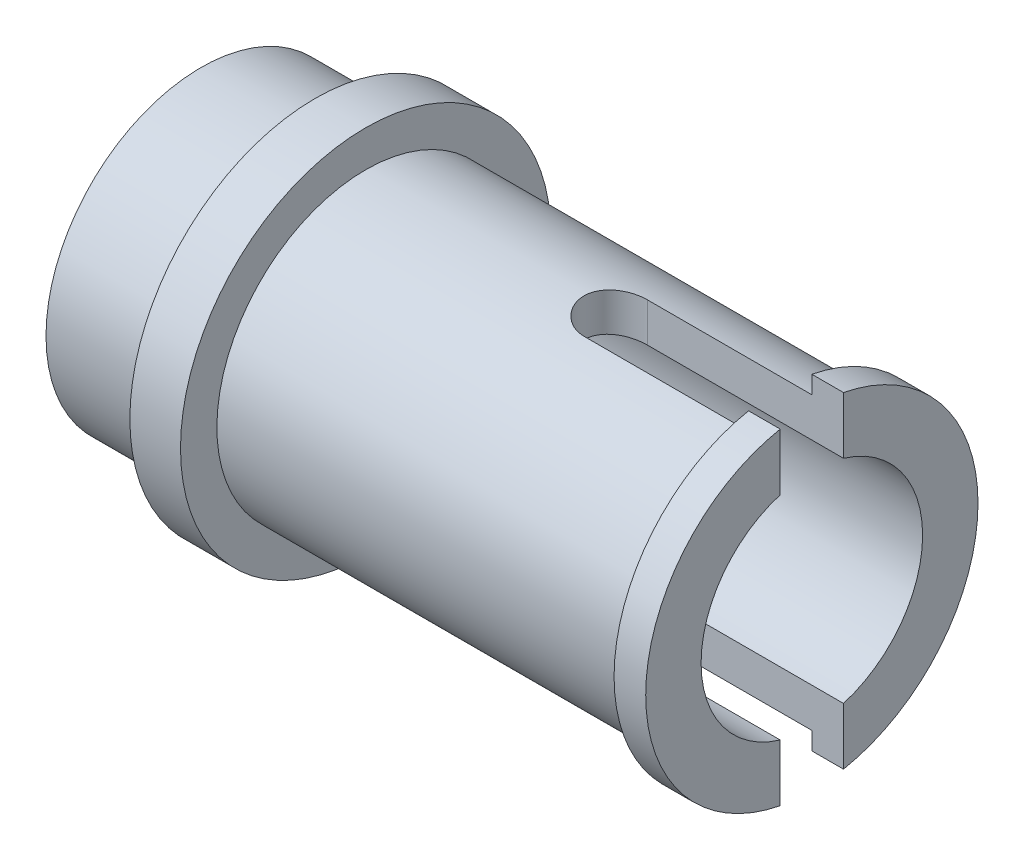
ISO-10303-21;
HEADER;
FILE_DESCRIPTION(('STEP AP214'),'2;1');
FILE_NAME('part.step','',(''),(''),'','','');
FILE_SCHEMA(('AUTOMOTIVE_DESIGN { 1 0 10303 214 1 1 1 1 }'));
ENDSEC;
DATA;
#1=APPLICATION_CONTEXT('core data for automotive mechanical design processes');
#2=APPLICATION_PROTOCOL_DEFINITION('international standard','automotive_design',2000,#1);
#3=PRODUCT_CONTEXT('',#1,'mechanical');
#4=PRODUCT('Part','Part','',(#3));
#5=PRODUCT_RELATED_PRODUCT_CATEGORY('part','',(#4));
#6=PRODUCT_DEFINITION_FORMATION('','',#4);
#7=PRODUCT_DEFINITION_CONTEXT('part definition',#1,'design');
#8=PRODUCT_DEFINITION('design','',#6,#7);
#9=PRODUCT_DEFINITION_SHAPE('','',#8);
#10=(LENGTH_UNIT() NAMED_UNIT(*) SI_UNIT(.MILLI.,.METRE.));
#11=(NAMED_UNIT(*) PLANE_ANGLE_UNIT() SI_UNIT($,.RADIAN.));
#12=(NAMED_UNIT(*) SI_UNIT($,.STERADIAN.) SOLID_ANGLE_UNIT());
#13=UNCERTAINTY_MEASURE_WITH_UNIT(LENGTH_MEASURE(1.E-05),#10,'distance_accuracy_value','');
#14=(GEOMETRIC_REPRESENTATION_CONTEXT(3) GLOBAL_UNCERTAINTY_ASSIGNED_CONTEXT((#13)) GLOBAL_UNIT_ASSIGNED_CONTEXT((#10,
#11,#12)) REPRESENTATION_CONTEXT('',''));
#15=CARTESIAN_POINT('',(0.,0.,0.));
#16=DIRECTION('',(0.,0.,1.));
#17=DIRECTION('',(1.,0.,0.));
#18=AXIS2_PLACEMENT_3D('',#15,#16,#17);
#19=CARTESIAN_POINT('',(7.85,0.,0.));
#20=DIRECTION('',(1.,0.,0.));
#21=DIRECTION('',(0.,0.,-1.));
#22=AXIS2_PLACEMENT_3D('',#19,#20,#21);
#23=PLANE('',#22);
#24=DIRECTION('',(0.,-1.,0.));
#25=VECTOR('',#24,1.);
#26=CARTESIAN_POINT('',(7.85,0.,0.5));
#27=LINE('',#26,#25);
#28=CARTESIAN_POINT('',(7.85,2.57694101601104,0.5));
#29=VERTEX_POINT('',#28);
#30=CARTESIAN_POINT('',(7.85,1.67705098312484,0.5));
#31=VERTEX_POINT('',#30);
#32=EDGE_CURVE('E166',#29,#31,#27,.T.);
#33=ORIENTED_EDGE('',*,*,#32,.F.);
#34=CARTESIAN_POINT('',(7.85,0.,0.));
#35=DIRECTION('',(1.,0.,0.));
#36=DIRECTION('',(0.,0.,-1.));
#37=AXIS2_PLACEMENT_3D('',#34,#35,#36);
#38=CIRCLE('',#37,2.625);
#39=CARTESIAN_POINT('',(7.85,-2.57694101601104,0.5));
#40=VERTEX_POINT('',#39);
#41=EDGE_CURVE('E239',#29,#40,#38,.T.);
#42=ORIENTED_EDGE('',*,*,#41,.T.);
#43=CARTESIAN_POINT('',(7.85,-1.67705098312484,0.5));
#44=VERTEX_POINT('',#43);
#45=EDGE_CURVE('E162',#44,#40,#27,.T.);
#46=ORIENTED_EDGE('',*,*,#45,.F.);
#47=CARTESIAN_POINT('',(7.85,0.,0.));
#48=DIRECTION('',(1.,0.,0.));
#49=DIRECTION('',(0.,0.,-1.));
#50=AXIS2_PLACEMENT_3D('',#47,#48,#49);
#51=CIRCLE('',#50,1.75);
#52=EDGE_CURVE('E241',#31,#44,#51,.T.);
#53=ORIENTED_EDGE('',*,*,#52,.F.);
#54=EDGE_LOOP('',(#33,#42,#46,#53));
#55=FACE_BOUND('',#54,.T.);
#56=ADVANCED_FACE('F33',(#55),#23,.T.);
#57=CARTESIAN_POINT('',(7.35,0.,0.));
#58=DIRECTION('',(1.,0.,0.));
#59=DIRECTION('',(0.,0.,-1.));
#60=AXIS2_PLACEMENT_3D('',#57,#58,#59);
#61=PLANE('',#60);
#62=CARTESIAN_POINT('',(7.35,0.,0.));
#63=DIRECTION('',(1.,0.,0.));
#64=DIRECTION('',(0.,0.,-1.));
#65=AXIS2_PLACEMENT_3D('',#62,#63,#64);
#66=CIRCLE('',#65,2.625);
#67=CARTESIAN_POINT('',(7.35,2.57694101601104,0.5));
#68=VERTEX_POINT('',#67);
#69=CARTESIAN_POINT('',(7.35,-2.57694101601104,0.5));
#70=VERTEX_POINT('',#69);
#71=EDGE_CURVE('E255',#68,#70,#66,.T.);
#72=ORIENTED_EDGE('',*,*,#71,.F.);
#73=DIRECTION('',(0.,-1.,0.));
#74=VECTOR('',#73,1.);
#75=CARTESIAN_POINT('',(7.35,0.,0.5));
#76=LINE('',#75,#74);
#77=CARTESIAN_POINT('',(7.35,2.29619250064101,0.5));
#78=VERTEX_POINT('',#77);
#79=EDGE_CURVE('E163',#68,#78,#76,.T.);
#80=ORIENTED_EDGE('',*,*,#79,.T.);
#81=CARTESIAN_POINT('',(7.35,0.,0.));
#82=DIRECTION('',(1.,0.,0.));
#83=DIRECTION('',(0.,0.,-1.));
#84=AXIS2_PLACEMENT_3D('',#81,#82,#83);
#85=CIRCLE('',#84,2.35);
#86=CARTESIAN_POINT('',(7.35,-2.29619250064101,0.5));
#87=VERTEX_POINT('',#86);
#88=EDGE_CURVE('E252',#78,#87,#85,.T.);
#89=ORIENTED_EDGE('',*,*,#88,.T.);
#90=EDGE_CURVE('E153',#87,#70,#76,.T.);
#91=ORIENTED_EDGE('',*,*,#90,.T.);
#92=EDGE_LOOP('',(#72,#80,#89,#91));
#93=FACE_BOUND('',#92,.T.);
#94=ADVANCED_FACE('F222',(#93),#61,.F.);
#95=CARTESIAN_POINT('',(7.85,0.,0.));
#96=DIRECTION('',(-1.,0.,0.));
#97=DIRECTION('',(0.,0.,1.));
#98=AXIS2_PLACEMENT_3D('',#95,#96,#97);
#99=CYLINDRICAL_SURFACE('',#98,2.625);
#100=ORIENTED_EDGE('',*,*,#41,.F.);
#101=DIRECTION('',(-1.,0.,0.));
#102=VECTOR('',#101,1.);
#103=CARTESIAN_POINT('',(7.85,2.57694101601104,0.5));
#104=LINE('',#103,#102);
#105=EDGE_CURVE('E206',#29,#68,#104,.T.);
#106=ORIENTED_EDGE('',*,*,#105,.T.);
#107=ORIENTED_EDGE('',*,*,#71,.T.);
#108=DIRECTION('',(-1.,0.,0.));
#109=VECTOR('',#108,1.);
#110=CARTESIAN_POINT('',(7.85,-2.57694101601104,0.5));
#111=LINE('',#110,#109);
#112=EDGE_CURVE('E249',#70,#40,#111,.F.);
#113=ORIENTED_EDGE('',*,*,#112,.T.);
#114=EDGE_LOOP('',(#100,#106,#107,#113));
#115=FACE_BOUND('',#114,.T.);
#116=ADVANCED_FACE('F219',(#115),#99,.T.);
#117=CARTESIAN_POINT('',(0.8,0.,0.));
#118=DIRECTION('',(1.,0.,0.));
#119=DIRECTION('',(0.,0.,-1.));
#120=AXIS2_PLACEMENT_3D('',#117,#118,#119);
#121=PLANE('',#120);
#122=CARTESIAN_POINT('',(0.8,0.,0.));
#123=DIRECTION('',(1.,0.,0.));
#124=DIRECTION('',(0.,0.,-1.));
#125=AXIS2_PLACEMENT_3D('',#122,#123,#124);
#126=CIRCLE('',#125,2.925);
#127=CARTESIAN_POINT('',(0.8,0.,-2.925));
#128=VERTEX_POINT('',#127);
#129=EDGE_CURVE('E265',#128,#128,#126,.T.);
#130=ORIENTED_EDGE('',*,*,#129,.T.);
#131=EDGE_LOOP('',(#130));
#132=FACE_BOUND('',#131,.T.);
#133=CARTESIAN_POINT('',(0.8,0.,0.));
#134=DIRECTION('',(1.,0.,0.));
#135=DIRECTION('',(0.,0.,-1.));
#136=AXIS2_PLACEMENT_3D('',#133,#134,#135);
#137=CIRCLE('',#136,2.35);
#138=CARTESIAN_POINT('',(0.8,0.,-2.35));
#139=VERTEX_POINT('',#138);
#140=EDGE_CURVE('E261',#139,#139,#137,.F.);
#141=ORIENTED_EDGE('',*,*,#140,.T.);
#142=EDGE_LOOP('',(#141));
#143=FACE_BOUND('',#142,.T.);
#144=ADVANCED_FACE('F315',(#132,#143),#121,.T.);
#145=CARTESIAN_POINT('',(0.,0.,0.));
#146=DIRECTION('',(1.,0.,0.));
#147=DIRECTION('',(0.,0.,-1.));
#148=AXIS2_PLACEMENT_3D('',#145,#146,#147);
#149=PLANE('',#148);
#150=CARTESIAN_POINT('',(0.,0.,0.));
#151=DIRECTION('',(-1.,0.,0.));
#152=DIRECTION('',(0.,0.,1.));
#153=AXIS2_PLACEMENT_3D('',#150,#151,#152);
#154=CIRCLE('',#153,2.45);
#155=CARTESIAN_POINT('',(0.,0.,2.45));
#156=VERTEX_POINT('',#155);
#157=EDGE_CURVE('E11',#156,#156,#154,.T.);
#158=ORIENTED_EDGE('',*,*,#157,.F.);
#159=EDGE_LOOP('',(#158));
#160=FACE_BOUND('',#159,.T.);
#161=CARTESIAN_POINT('',(0.,0.,0.));
#162=DIRECTION('',(1.,0.,0.));
#163=DIRECTION('',(0.,0.,-1.));
#164=AXIS2_PLACEMENT_3D('',#161,#162,#163);
#165=CIRCLE('',#164,2.925);
#166=CARTESIAN_POINT('',(0.,0.,-2.925));
#167=VERTEX_POINT('',#166);
#168=EDGE_CURVE('E264',#167,#167,#165,.T.);
#169=ORIENTED_EDGE('',*,*,#168,.F.);
#170=EDGE_LOOP('',(#169));
#171=FACE_BOUND('',#170,.T.);
#172=ADVANCED_FACE('F312',(#160,#171),#149,.F.);
#173=CARTESIAN_POINT('',(0.8,0.,0.));
#174=DIRECTION('',(-1.,0.,0.));
#175=DIRECTION('',(0.,0.,1.));
#176=AXIS2_PLACEMENT_3D('',#173,#174,#175);
#177=CYLINDRICAL_SURFACE('',#176,2.925);
#178=ORIENTED_EDGE('',*,*,#129,.F.);
#179=EDGE_LOOP('',(#178));
#180=FACE_BOUND('',#179,.T.);
#181=ORIENTED_EDGE('',*,*,#168,.T.);
#182=EDGE_LOOP('',(#181));
#183=FACE_BOUND('',#182,.T.);
#184=ADVANCED_FACE('F35',(#180,#183),#177,.T.);
#185=CARTESIAN_POINT('',(0.8,0.,0.));
#186=DIRECTION('',(-1.,0.,0.));
#187=DIRECTION('',(0.,0.,1.));
#188=AXIS2_PLACEMENT_3D('',#185,#186,#187);
#189=CYLINDRICAL_SURFACE('',#188,1.75);
#190=DIRECTION('',(-1.,0.,0.));
#191=VECTOR('',#190,1.);
#192=CARTESIAN_POINT('',(0.8,-1.67705098312484,0.5));
#193=LINE('',#192,#191);
#194=CARTESIAN_POINT('',(4.75,-1.67705098312484,0.5));
#195=VERTEX_POINT('',#194);
#196=EDGE_CURVE('E168',#195,#44,#193,.F.);
#197=ORIENTED_EDGE('',*,*,#196,.F.);
#198=CARTESIAN_POINT('',(4.75,-1.67705098312484,0.499999999999997));
#199=CARTESIAN_POINT('',(4.77746288446138,-1.6770513676491,0.499999505117306));
#200=CARTESIAN_POINT('',(4.80493077103988,-1.67773294968617,0.497729666504693));
#201=CARTESIAN_POINT('',(4.85906780969378,-1.68037597350957,0.488730908481071));
#202=CARTESIAN_POINT('',(4.88573663227078,-1.68233793587311,0.482000175341647));
#203=CARTESIAN_POINT('',(4.9374843002256,-1.68730177367251,0.464323358230202));
#204=CARTESIAN_POINT('',(4.96256553795636,-1.69030203810819,0.453383801629157));
#205=CARTESIAN_POINT('',(5.01054195288652,-1.6970023027756,0.427620910157868));
#206=CARTESIAN_POINT('',(5.03343687009395,-1.70070238607254,0.412797114166007));
#207=CARTESIAN_POINT('',(5.07704789132928,-1.70850445802558,0.379231200245349));
#208=CARTESIAN_POINT('',(5.09769195053246,-1.71261438990775,0.360397302783082));
#209=CARTESIAN_POINT('',(5.13557569582579,-1.72070491378267,0.319542811367355));
#210=CARTESIAN_POINT('',(5.15281498328067,-1.72468549058484,0.297521844789917));
#211=CARTESIAN_POINT('',(5.18370716208842,-1.73215833000306,0.250411508039385));
#212=CARTESIAN_POINT('',(5.19728740493775,-1.73564013625197,0.225272695940463));
#213=CARTESIAN_POINT('',(5.22000044360398,-1.74163135121402,0.172952118809912));
#214=CARTESIAN_POINT('',(5.22913410531006,-1.74414094922722,0.145770752718793));
#215=CARTESIAN_POINT('',(5.24245861530993,-1.74784879825054,0.0908896437802933));
#216=CARTESIAN_POINT('',(5.24677225542617,-1.74907956752824,0.0632219495322596));
#217=CARTESIAN_POINT('',(5.25072168347081,-1.75020523914925,0.00753002560548117));
#218=CARTESIAN_POINT('',(5.25035836558434,-1.75010039684746,-0.0204941348971368));
#219=CARTESIAN_POINT('',(5.24504840627049,-1.74859001690827,-0.0752450489338047));
#220=CARTESIAN_POINT('',(5.2402345968405,-1.74722217694014,-0.101985886527236));
#221=CARTESIAN_POINT('',(5.2263762243839,-1.74338471582533,-0.154263055544403));
#222=CARTESIAN_POINT('',(5.21733140393447,-1.74091502764053,-0.179799313575126));
#223=CARTESIAN_POINT('',(5.19517264979704,-1.73509757943031,-0.22926845843223));
#224=CARTESIAN_POINT('',(5.18201530554791,-1.73174051378046,-0.253180760962692));
#225=CARTESIAN_POINT('',(5.15203885340049,-1.72450692243497,-0.298501810897619));
#226=CARTESIAN_POINT('',(5.13521894308338,-1.72063028297938,-0.319910008104));
#227=CARTESIAN_POINT('',(5.09769857234535,-1.71261420754957,-0.360408162136937));
#228=CARTESIAN_POINT('',(5.07688264159872,-1.7084703234254,-0.379390394396224));
#229=CARTESIAN_POINT('',(5.03232122703852,-1.70050743446555,-0.413623253937436));
#230=CARTESIAN_POINT('',(5.00857550576281,-1.6966884560062,-0.428873578445641));
#231=CARTESIAN_POINT('',(4.95856727887544,-1.68978793704329,-0.455308339963625));
#232=CARTESIAN_POINT('',(4.93228619373687,-1.68671252737383,-0.46645934447196));
#233=CARTESIAN_POINT('',(4.87811170912406,-1.68172136094114,-0.484147378740187));
#234=CARTESIAN_POINT('',(4.85021878133583,-1.67980526678226,-0.490685751006642));
#235=CARTESIAN_POINT('',(4.79462989391906,-1.67742278808874,-0.49876854299941));
#236=CARTESIAN_POINT('',(4.76695954576978,-1.67690927865224,-0.500475370393477));
#237=CARTESIAN_POINT('',(4.71172792102127,-1.67726039935115,-0.499297491799224));
#238=CARTESIAN_POINT('',(4.68416663124635,-1.67812485757671,-0.49641335856124));
#239=CARTESIAN_POINT('',(4.63058969299236,-1.68108857504136,-0.486279453564642));
#240=CARTESIAN_POINT('',(4.6045531034957,-1.6831591073887,-0.479131155460301));
#241=CARTESIAN_POINT('',(4.55404953200108,-1.68827265985176,-0.460787904666118));
#242=CARTESIAN_POINT('',(4.52958277708873,-1.69131582028461,-0.44959236806693));
#243=CARTESIAN_POINT('',(4.48224448119567,-1.69812547001655,-0.423154912804043));
#244=CARTESIAN_POINT('',(4.45942738894942,-1.70190799345095,-0.407819729322822));
#245=CARTESIAN_POINT('',(4.4166309066392,-1.70973431637644,-0.373651159212104));
#246=CARTESIAN_POINT('',(4.39665213324698,-1.71377817236953,-0.35481701442034));
#247=CARTESIAN_POINT('',(4.35940514542795,-1.72183681858969,-0.313427002491386));
#248=CARTESIAN_POINT('',(4.34225125714532,-1.72584601511522,-0.290766927560135));
#249=CARTESIAN_POINT('',(4.31198857965432,-1.73324494261514,-0.242796326764385));
#250=CARTESIAN_POINT('',(4.29887957901941,-1.73663470596357,-0.217485939524544));
#251=CARTESIAN_POINT('',(4.27720392824342,-1.74239126211598,-0.16510831823904));
#252=CARTESIAN_POINT('',(4.26860290260346,-1.74476577031811,-0.138056199974908));
#253=CARTESIAN_POINT('',(4.25609329951496,-1.74825834905972,-0.0828114121374799));
#254=CARTESIAN_POINT('',(4.25218351495467,-1.74937674280755,-0.0546190378963586));
#255=CARTESIAN_POINT('',(4.24925214150056,-1.75021333750821,0.0010445594897578));
#256=CARTESIAN_POINT('',(4.2500639627293,-1.74997925897249,0.0285064077624895));
#257=CARTESIAN_POINT('',(4.25615957035258,-1.74824767280534,0.0828862931055009));
#258=CARTESIAN_POINT('',(4.26144314259551,-1.74675022567648,0.109804356154383));
#259=CARTESIAN_POINT('',(4.27623284024472,-1.74267200465029,0.162101033259897));
#260=CARTESIAN_POINT('',(4.285700794736,-1.74010103512045,0.187491258358762));
#261=CARTESIAN_POINT('',(4.30855653957137,-1.73414273535862,0.236336800690365));
#262=CARTESIAN_POINT('',(4.32194493677307,-1.73075527875441,0.259791817645169));
#263=CARTESIAN_POINT('',(4.35272433435621,-1.72339738860052,0.304858364088476));
#264=CARTESIAN_POINT('',(4.3702225216971,-1.71941261446576,0.326394332001768));
#265=CARTESIAN_POINT('',(4.40852728136349,-1.71136016246614,0.366280305579593));
#266=CARTESIAN_POINT('',(4.42933476777123,-1.7072924619671,0.384629428047442));
#267=CARTESIAN_POINT('',(4.47432422924884,-1.69941009386038,0.418102115072819));
#268=CARTESIAN_POINT('',(4.49858048687578,-1.69560487942391,0.43312829180901));
#269=CARTESIAN_POINT('',(4.54938046632875,-1.68882111332642,0.458869859049017));
#270=CARTESIAN_POINT('',(4.57592289777242,-1.68584209928957,0.469587662212042));
#271=CARTESIAN_POINT('',(4.62691342505788,-1.68139614890017,0.485246335031258));
#272=CARTESIAN_POINT('',(4.65117258702463,-1.6797810971154,0.49076474995463));
#273=CARTESIAN_POINT('',(4.70028652958898,-1.67760842363589,0.498141517608912));
#274=CARTESIAN_POINT('',(4.7251412155615,-1.67705063506215,0.500000447956662));
#275=CARTESIAN_POINT('',(4.75,-1.67705098312484,0.499999999999997));
#276=B_SPLINE_CURVE_WITH_KNOTS('',3,(#198,#199,#200,#201,#202,#203,#204,#205,#206,#207,#208,
#209,#210,#211,#212,#213,#214,#215,#216,#217,#218,#219,#220,#221,#222,#223,#224,#225,#226,#227,
#228,#229,#230,#231,#232,#233,#234,#235,#236,#237,#238,#239,#240,#241,#242,#243,#244,#245,#246,
#247,#248,#249,#250,#251,#252,#253,#254,#255,#256,#257,#258,#259,#260,#261,#262,#263,#264,#265,
#266,#267,#268,#269,#270,#271,#272,#273,#274,#275),.UNSPECIFIED.,.T.,.F.,(4,2,2,2,2,2,2,2,2,2,2,
2,2,2,2,2,2,2,2,2,2,2,2,2,2,2,2,2,2,2,2,2,2,2,2,2,2,2,4),(0.,0.0822970855795509,
0.164627652382574,0.246831045911967,0.329044202729694,0.413392917994398,0.497751503074064,
0.583678707512471,0.66958917252212,0.75325725254971,0.8369093363589,0.918142594086408,
0.999380794844159,1.08150725842408,1.16365173293994,1.24867903171035,1.33371322655225,
1.41942630155287,1.50511441946038,1.58788590830272,1.67064707170638,1.75151322410154,
1.83239104800036,1.91527001506621,1.99816696151052,2.0838634709019,2.16955550017187,
2.25458421320548,2.33959104265185,2.4216172441704,2.50363951768669,2.58492853093328,
2.66623013381831,2.74994942182368,2.83369187474854,2.91963403101352,3.00552799299938,
3.08003322212648,3.15452669032775),.UNSPECIFIED.);
#277=CARTESIAN_POINT('',(4.75,-1.67705098312484,-0.499999999999997));
#278=VERTEX_POINT('',#277);
#279=EDGE_CURVE('E181',#278,#195,#276,.T.);
#280=ORIENTED_EDGE('',*,*,#279,.F.);
#281=DIRECTION('',(-1.,0.,0.));
#282=VECTOR('',#281,1.);
#283=CARTESIAN_POINT('',(0.8,-1.67705098312484,-0.499999999999995));
#284=LINE('',#283,#282);
#285=CARTESIAN_POINT('',(7.85,-1.67705098312484,-0.499999999999995));
#286=VERTEX_POINT('',#285);
#287=EDGE_CURVE('E142',#286,#278,#284,.T.);
#288=ORIENTED_EDGE('',*,*,#287,.F.);
#289=CARTESIAN_POINT('',(7.85,1.67705098312484,-0.499999999999995));
#290=VERTEX_POINT('',#289);
#291=EDGE_CURVE('E257',#286,#290,#51,.T.);
#292=ORIENTED_EDGE('',*,*,#291,.T.);
#293=DIRECTION('',(-1.,0.,0.));
#294=VECTOR('',#293,1.);
#295=CARTESIAN_POINT('',(0.8,1.67705098312484,-0.499999999999995));
#296=LINE('',#295,#294);
#297=CARTESIAN_POINT('',(4.75,1.67705098312484,-0.499999999999997));
#298=VERTEX_POINT('',#297);
#299=EDGE_CURVE('E157',#298,#290,#296,.F.);
#300=ORIENTED_EDGE('',*,*,#299,.F.);
#301=CARTESIAN_POINT('',(4.75,1.67705098312484,0.499999999999997));
#302=CARTESIAN_POINT('',(4.72253711553862,1.6770513676491,0.499999505117306));
#303=CARTESIAN_POINT('',(4.69506922896012,1.67773294968617,0.497729666504693));
#304=CARTESIAN_POINT('',(4.64093219030622,1.68037597350957,0.488730908481071));
#305=CARTESIAN_POINT('',(4.61426336772922,1.68233793587311,0.482000175341647));
#306=CARTESIAN_POINT('',(4.5625156997744,1.68730177367251,0.464323358230202));
#307=CARTESIAN_POINT('',(4.53743446204365,1.69030203810819,0.453383801629157));
#308=CARTESIAN_POINT('',(4.48945804711348,1.6970023027756,0.427620910157868));
#309=CARTESIAN_POINT('',(4.46656312990606,1.70070238607254,0.412797114166007));
#310=CARTESIAN_POINT('',(4.42295210867072,1.70850445802558,0.379231200245349));
#311=CARTESIAN_POINT('',(4.40230804946754,1.71261438990775,0.360397302783082));
#312=CARTESIAN_POINT('',(4.36442430417421,1.72070491378267,0.319542811367355));
#313=CARTESIAN_POINT('',(4.34718501671933,1.72468549058484,0.297521844789917));
#314=CARTESIAN_POINT('',(4.31629283791158,1.73215833000306,0.250411508039385));
#315=CARTESIAN_POINT('',(4.30271259506225,1.73564013625197,0.225272695940462));
#316=CARTESIAN_POINT('',(4.27999955639602,1.74163135121402,0.172952118809912));
#317=CARTESIAN_POINT('',(4.27086589468994,1.74414094922722,0.145770752718793));
#318=CARTESIAN_POINT('',(4.25754138469007,1.74784879825054,0.0908896437802933));
#319=CARTESIAN_POINT('',(4.25322774457384,1.74907956752824,0.0632219495322596));
#320=CARTESIAN_POINT('',(4.2492783165292,1.75020523914925,0.00753002560548118));
#321=CARTESIAN_POINT('',(4.24964163441566,1.75010039684746,-0.0204941348971368));
#322=CARTESIAN_POINT('',(4.25495159372951,1.74859001690827,-0.0752450489338047));
#323=CARTESIAN_POINT('',(4.2597654031595,1.74722217694014,-0.101985886527236));
#324=CARTESIAN_POINT('',(4.2736237756161,1.74338471582533,-0.154263055544403));
#325=CARTESIAN_POINT('',(4.28266859606553,1.74091502764053,-0.179799313575126));
#326=CARTESIAN_POINT('',(4.30482735020296,1.73509757943031,-0.22926845843223));
#327=CARTESIAN_POINT('',(4.31798469445209,1.73174051378046,-0.253180760962692));
#328=CARTESIAN_POINT('',(4.34796114659951,1.72450692243497,-0.298501810897619));
#329=CARTESIAN_POINT('',(4.36478105691662,1.72063028297938,-0.319910008104));
#330=CARTESIAN_POINT('',(4.40230142765465,1.71261420754957,-0.360408162136937));
#331=CARTESIAN_POINT('',(4.42311735840128,1.7084703234254,-0.379390394396224));
#332=CARTESIAN_POINT('',(4.46767877296148,1.70050743446555,-0.413623253937436));
#333=CARTESIAN_POINT('',(4.4914244942372,1.6966884560062,-0.428873578445641));
#334=CARTESIAN_POINT('',(4.54143272112456,1.68978793704329,-0.455308339963625));
#335=CARTESIAN_POINT('',(4.56771380626313,1.68671252737383,-0.46645934447196));
#336=CARTESIAN_POINT('',(4.62188829087594,1.68172136094114,-0.484147378740187));
#337=CARTESIAN_POINT('',(4.64978121866417,1.67980526678226,-0.490685751006642));
#338=CARTESIAN_POINT('',(4.70537010608095,1.67742278808874,-0.49876854299941));
#339=CARTESIAN_POINT('',(4.73304045423022,1.67690927865224,-0.500475370393477));
#340=CARTESIAN_POINT('',(4.78827207897873,1.67726039935115,-0.499297491799224));
#341=CARTESIAN_POINT('',(4.81583336875365,1.67812485757671,-0.49641335856124));
#342=CARTESIAN_POINT('',(4.86941030700764,1.68108857504136,-0.486279453564642));
#343=CARTESIAN_POINT('',(4.8954468965043,1.6831591073887,-0.479131155460301));
#344=CARTESIAN_POINT('',(4.94595046799892,1.68827265985176,-0.460787904666118));
#345=CARTESIAN_POINT('',(4.97041722291127,1.69131582028461,-0.44959236806693));
#346=CARTESIAN_POINT('',(5.01775551880433,1.69812547001655,-0.423154912804043));
#347=CARTESIAN_POINT('',(5.04057261105059,1.70190799345095,-0.407819729322822));
#348=CARTESIAN_POINT('',(5.0833690933608,1.70973431637644,-0.373651159212104));
#349=CARTESIAN_POINT('',(5.10334786675302,1.71377817236953,-0.35481701442034));
#350=CARTESIAN_POINT('',(5.14059485457206,1.72183681858969,-0.313427002491386));
#351=CARTESIAN_POINT('',(5.15774874285468,1.72584601511522,-0.290766927560135));
#352=CARTESIAN_POINT('',(5.18801142034568,1.73324494261514,-0.242796326764385));
#353=CARTESIAN_POINT('',(5.20112042098059,1.73663470596357,-0.217485939524544));
#354=CARTESIAN_POINT('',(5.22279607175658,1.74239126211598,-0.16510831823904));
#355=CARTESIAN_POINT('',(5.23139709739654,1.74476577031811,-0.138056199974908));
#356=CARTESIAN_POINT('',(5.24390670048504,1.74825834905972,-0.0828114121374798));
#357=CARTESIAN_POINT('',(5.24781648504533,1.74937674280755,-0.0546190378963586));
#358=CARTESIAN_POINT('',(5.25074785849945,1.75021333750821,0.0010445594897578));
#359=CARTESIAN_POINT('',(5.2499360372707,1.74997925897249,0.0285064077624895));
#360=CARTESIAN_POINT('',(5.24384042964742,1.74824767280534,0.0828862931055009));
#361=CARTESIAN_POINT('',(5.23855685740449,1.74675022567648,0.109804356154383));
#362=CARTESIAN_POINT('',(5.22376715975529,1.74267200465029,0.162101033259897));
#363=CARTESIAN_POINT('',(5.214299205264,1.74010103512045,0.187491258358762));
#364=CARTESIAN_POINT('',(5.19144346042863,1.73414273535862,0.236336800690365));
#365=CARTESIAN_POINT('',(5.17805506322693,1.73075527875441,0.259791817645169));
#366=CARTESIAN_POINT('',(5.1472756656438,1.72339738860052,0.304858364088476));
#367=CARTESIAN_POINT('',(5.1297774783029,1.71941261446576,0.326394332001768));
#368=CARTESIAN_POINT('',(5.09147271863651,1.71136016246614,0.366280305579592));
#369=CARTESIAN_POINT('',(5.07066523222877,1.7072924619671,0.384629428047442));
#370=CARTESIAN_POINT('',(5.02567577075116,1.69941009386038,0.418102115072819));
#371=CARTESIAN_POINT('',(5.00141951312422,1.69560487942391,0.43312829180901));
#372=CARTESIAN_POINT('',(4.95061953367125,1.68882111332642,0.458869859049017));
#373=CARTESIAN_POINT('',(4.92407710222759,1.68584209928957,0.469587662212042));
#374=CARTESIAN_POINT('',(4.87308657494212,1.68139614890017,0.485246335031258));
#375=CARTESIAN_POINT('',(4.84882741297537,1.6797810971154,0.49076474995463));
#376=CARTESIAN_POINT('',(4.79971347041102,1.67760842363589,0.498141517608912));
#377=CARTESIAN_POINT('',(4.7748587844385,1.67705063506215,0.500000447956662));
#378=CARTESIAN_POINT('',(4.75,1.67705098312484,0.499999999999997));
#379=B_SPLINE_CURVE_WITH_KNOTS('',3,(#301,#302,#303,#304,#305,#306,#307,#308,#309,#310,#311,
#312,#313,#314,#315,#316,#317,#318,#319,#320,#321,#322,#323,#324,#325,#326,#327,#328,#329,#330,
#331,#332,#333,#334,#335,#336,#337,#338,#339,#340,#341,#342,#343,#344,#345,#346,#347,#348,#349,
#350,#351,#352,#353,#354,#355,#356,#357,#358,#359,#360,#361,#362,#363,#364,#365,#366,#367,#368,
#369,#370,#371,#372,#373,#374,#375,#376,#377,#378),.UNSPECIFIED.,.T.,.F.,(4,2,2,2,2,2,2,2,2,2,2,
2,2,2,2,2,2,2,2,2,2,2,2,2,2,2,2,2,2,2,2,2,2,2,2,2,2,2,4),(0.,0.0822970855795509,
0.164627652382574,0.246831045911967,0.329044202729694,0.413392917994398,0.497751503074064,
0.583678707512472,0.66958917252212,0.75325725254971,0.8369093363589,0.918142594086408,
0.999380794844159,1.08150725842408,1.16365173293994,1.24867903171035,1.33371322655225,
1.41942630155287,1.50511441946038,1.58788590830272,1.67064707170638,1.75151322410154,
1.83239104800036,1.91527001506621,1.99816696151052,2.0838634709019,2.16955550017187,
2.25458421320548,2.33959104265185,2.4216172441704,2.50363951768669,2.58492853093328,
2.66623013381831,2.74994942182368,2.83369187474854,2.91963403101352,3.00552799299938,
3.08003322212648,3.15452669032775),.UNSPECIFIED.);
#380=CARTESIAN_POINT('',(4.75,1.67705098312484,0.5));
#381=VERTEX_POINT('',#380);
#382=EDGE_CURVE('E175',#381,#298,#379,.T.);
#383=ORIENTED_EDGE('',*,*,#382,.F.);
#384=DIRECTION('',(-1.,0.,0.));
#385=VECTOR('',#384,1.);
#386=CARTESIAN_POINT('',(0.8,1.67705098312484,0.5));
#387=LINE('',#386,#385);
#388=EDGE_CURVE('E173',#31,#381,#387,.T.);
#389=ORIENTED_EDGE('',*,*,#388,.F.);
#390=ORIENTED_EDGE('',*,*,#52,.T.);
#391=EDGE_LOOP('',(#197,#280,#288,#292,#300,#383,#389,#390));
#392=FACE_BOUND('',#391,.T.);
#393=CARTESIAN_POINT('',(-1.8,0.,0.));
#394=DIRECTION('',(-1.,0.,0.));
#395=DIRECTION('',(0.,0.,1.));
#396=AXIS2_PLACEMENT_3D('',#393,#394,#395);
#397=CIRCLE('',#396,1.75);
#398=CARTESIAN_POINT('',(-1.8,0.,1.75));
#399=VERTEX_POINT('',#398);
#400=EDGE_CURVE('E289',#399,#399,#397,.T.);
#401=ORIENTED_EDGE('',*,*,#400,.T.);
#402=EDGE_LOOP('',(#401));
#403=FACE_BOUND('',#402,.T.);
#404=ADVANCED_FACE('F186',(#392,#403),#189,.F.);
#405=CARTESIAN_POINT('',(7.35,0.,0.));
#406=DIRECTION('',(-1.,0.,0.));
#407=DIRECTION('',(0.,0.,1.));
#408=AXIS2_PLACEMENT_3D('',#405,#406,#407);
#409=CYLINDRICAL_SURFACE('',#408,2.35);
#410=ORIENTED_EDGE('',*,*,#140,.F.);
#411=EDGE_LOOP('',(#410));
#412=FACE_BOUND('',#411,.T.);
#413=CARTESIAN_POINT('',(4.75,-2.29619250064101,0.499999999999997));
#414=CARTESIAN_POINT('',(4.77774200454216,-2.29619306039774,0.49999902117198));
#415=CARTESIAN_POINT('',(4.80549595436025,-2.29670073144693,0.497683294381166));
#416=CARTESIAN_POINT('',(4.86021593700897,-2.29867307663628,0.488490914607464));
#417=CARTESIAN_POINT('',(4.8871813645621,-2.30013846677704,0.481610849220222));
#418=CARTESIAN_POINT('',(4.93952480726498,-2.30385294535071,0.463515109774604));
#419=CARTESIAN_POINT('',(4.96490447742931,-2.30610120005134,0.45230404674197));
#420=CARTESIAN_POINT('',(5.01342286811212,-2.31112708644982,0.425877569151565));
#421=CARTESIAN_POINT('',(5.03656166041518,-2.3139047011816,0.410662282923656));
#422=CARTESIAN_POINT('',(5.0803120929943,-2.3197259606621,0.376399930328175));
#423=CARTESIAN_POINT('',(5.10088268420848,-2.32277285211421,0.357300990200362));
#424=CARTESIAN_POINT('',(5.13855365588799,-2.32876088432473,0.315925493945804));
#425=CARTESIAN_POINT('',(5.15565377550661,-2.33170201712047,0.293648699180089));
#426=CARTESIAN_POINT('',(5.18605976484064,-2.33718239435287,0.246275730654575));
#427=CARTESIAN_POINT('',(5.19932630660281,-2.33971736193672,0.22115377724948));
#428=CARTESIAN_POINT('',(5.22143433070997,-2.34406317856182,0.168974213060684));
#429=CARTESIAN_POINT('',(5.23027628249508,-2.34587410441836,0.141916807972825));
#430=CARTESIAN_POINT('',(5.24315546006787,-2.34854485399189,0.0870609649725986));
#431=CARTESIAN_POINT('',(5.24726211015868,-2.34941840696142,0.0592795063170674));
#432=CARTESIAN_POINT('',(5.25077102189904,-2.35016350345714,0.00340914777916582));
#433=CARTESIAN_POINT('',(5.25017379396235,-2.35003515569874,-0.0246797184163852));
#434=CARTESIAN_POINT('',(5.24434391983802,-2.34880145243002,-0.0798894665245999));
#435=CARTESIAN_POINT('',(5.2391860876736,-2.34771186612256,-0.107018652463644));
#436=CARTESIAN_POINT('',(5.22450045415288,-2.34469601800437,-0.160017392130863));
#437=CARTESIAN_POINT('',(5.21497246234065,-2.34276971972908,-0.185886890906254));
#438=CARTESIAN_POINT('',(5.19174977804838,-2.33827132077434,-0.235841477593677));
#439=CARTESIAN_POINT('',(5.17802641640235,-2.33569479860266,-0.259912823450316));
#440=CARTESIAN_POINT('',(5.14682387112595,-2.33017896706692,-0.305438397666981));
#441=CARTESIAN_POINT('',(5.12934420165543,-2.32723961079491,-0.3268922869224));
#442=CARTESIAN_POINT('',(5.09071688411621,-2.32125346344257,-0.367018603626635));
#443=CARTESIAN_POINT('',(5.06950375586307,-2.3182056966445,-0.385627904527418));
#444=CARTESIAN_POINT('',(5.02422651900569,-2.31240070421899,-0.419036224599953));
#445=CARTESIAN_POINT('',(5.00016234130018,-2.30964348563667,-0.433835151391559));
#446=CARTESIAN_POINT('',(4.94976778781402,-2.30472939936551,-0.459228611050238));
#447=CARTESIAN_POINT('',(4.92343151486988,-2.3025741594394,-0.469811776682068));
#448=CARTESIAN_POINT('',(4.86929778743968,-2.29913100779383,-0.486383577652793));
#449=CARTESIAN_POINT('',(4.84150055169212,-2.29784296663204,-0.49237289870995));
#450=CARTESIAN_POINT('',(4.7858092453284,-2.29630630028679,-0.499490253525793));
#451=CARTESIAN_POINT('',(4.75792741726805,-2.29603807770846,-0.500709956120155));
#452=CARTESIAN_POINT('',(4.70235879329373,-2.29651863808807,-0.498501140165495));
#453=CARTESIAN_POINT('',(4.67467198487238,-2.29726735521754,-0.495072922485291));
#454=CARTESIAN_POINT('',(4.62059487493781,-2.29967897743145,-0.483744952301259));
#455=CARTESIAN_POINT('',(4.59419360292677,-2.30133165565552,-0.475895193319626));
#456=CARTESIAN_POINT('',(4.54308099415861,-2.30535584391806,-0.456000874980455));
#457=CARTESIAN_POINT('',(4.51836981216871,-2.30772741968067,-0.443955932069475));
#458=CARTESIAN_POINT('',(4.47094069509016,-2.31296556059342,-0.415809386479261));
#459=CARTESIAN_POINT('',(4.44825720321443,-2.31583885872203,-0.399651022604329));
#460=CARTESIAN_POINT('',(4.40589011560841,-2.32173870783471,-0.363811035559557));
#461=CARTESIAN_POINT('',(4.38620687192615,-2.32476527674811,-0.344128999511615));
#462=CARTESIAN_POINT('',(4.35004591105538,-2.33069492485461,-0.301386624145562));
#463=CARTESIAN_POINT('',(4.33363052359415,-2.33359490400807,-0.278273050652532));
#464=CARTESIAN_POINT('',(4.30491578454152,-2.33888863940928,-0.229563081170973));
#465=CARTESIAN_POINT('',(4.29261624653487,-2.34128241858206,-0.203966797697208));
#466=CARTESIAN_POINT('',(4.27257048136014,-2.34528091253335,-0.151172863188564));
#467=CARTESIAN_POINT('',(4.26479633060498,-2.34689045611289,-0.123986196910605));
#468=CARTESIAN_POINT('',(4.25393437092615,-2.34915995208228,-0.0686548266259169));
#469=CARTESIAN_POINT('',(4.25084591925079,-2.34982003471195,-0.0405102545596867));
#470=CARTESIAN_POINT('',(4.24947062128666,-2.35011262580816,0.0153451267513627));
#471=CARTESIAN_POINT('',(4.25109050650829,-2.34976509466114,0.0430535764427969));
#472=CARTESIAN_POINT('',(4.25887815761012,-2.34812401067665,0.0977936953568741));
#473=CARTESIAN_POINT('',(4.26504585013295,-2.34683047309853,0.124825375488725));
#474=CARTESIAN_POINT('',(4.28171037461733,-2.34344389964013,0.177377057446457));
#475=CARTESIAN_POINT('',(4.29219463532339,-2.34135318669062,0.202901204899927));
#476=CARTESIAN_POINT('',(4.317182166846,-2.33659611624391,0.2518408313366));
#477=CARTESIAN_POINT('',(4.33168580477673,-2.3339297061697,0.275256117445698));
#478=CARTESIAN_POINT('',(4.36460795305652,-2.32825257936879,0.319770370739422));
#479=CARTESIAN_POINT('',(4.38309243200137,-2.32523651440154,0.340819871199223));
#480=CARTESIAN_POINT('',(4.42331765977936,-2.31922975861697,0.379550199846015));
#481=CARTESIAN_POINT('',(4.4450591873067,-2.31623907404876,0.397230220155694));
#482=CARTESIAN_POINT('',(4.49150796638535,-2.31058019051332,0.42893172021785));
#483=CARTESIAN_POINT('',(4.51624889152632,-2.30791648977167,0.442904707144034));
#484=CARTESIAN_POINT('',(4.56777858004244,-2.30326916533914,0.466472473982139));
#485=CARTESIAN_POINT('',(4.59456554548519,-2.30128495277698,0.476071047332759));
#486=CARTESIAN_POINT('',(4.6428259549895,-2.29859777067883,0.488855154791016));
#487=CARTESIAN_POINT('',(4.66403298560129,-2.297701648931,0.493026635909968));
#488=CARTESIAN_POINT('',(4.70682427656362,-2.29649880895897,0.498599378910271));
#489=CARTESIAN_POINT('',(4.72840852039211,-2.29619206498481,0.50000076181752));
#490=CARTESIAN_POINT('',(4.75,-2.29619250064101,0.499999999999997));
#491=B_SPLINE_CURVE_WITH_KNOTS('',3,(#413,#414,#415,#416,#417,#418,#419,#420,#421,#422,#423,
#424,#425,#426,#427,#428,#429,#430,#431,#432,#433,#434,#435,#436,#437,#438,#439,#440,#441,#442,
#443,#444,#445,#446,#447,#448,#449,#450,#451,#452,#453,#454,#455,#456,#457,#458,#459,#460,#461,
#462,#463,#464,#465,#466,#467,#468,#469,#470,#471,#472,#473,#474,#475,#476,#477,#478,#479,#480,
#481,#482,#483,#484,#485,#486,#487,#488,#489,#490),.UNSPECIFIED.,.T.,.F.,(4,2,2,2,2,2,2,2,2,2,2,
2,2,2,2,2,2,2,2,2,2,2,2,2,2,2,2,2,2,2,2,2,2,2,2,2,2,2,4),(0.,0.0831469075866334,
0.166356047869445,0.249476842047858,0.332594972643152,0.416906359728934,0.501224081460726,
0.586378362135067,0.671523606194494,0.755403994014607,0.83927528017153,0.921795716401585,
1.00431974929652,1.087420818873,1.17053264320228,1.25528190133494,1.34003321396714,
1.42501152494284,1.50997714882708,1.59330152399733,1.67662050567808,1.75901579918036,
1.84141862782255,1.9250267946349,2.00864476445935,2.09373044959877,2.17881228051161,
2.2633633972312,2.34790291476656,2.43077925348309,2.51365425541065,2.59628958663498,
2.6789324679359,2.76306779580426,2.84722327091864,2.93243066004507,3.01756401708869,
3.08227971552943,3.14699258647168),.UNSPECIFIED.);
#492=CARTESIAN_POINT('',(4.75,-2.29619250064101,-0.499999999999997));
#493=VERTEX_POINT('',#492);
#494=CARTESIAN_POINT('',(4.75,-2.29619250064101,0.5));
#495=VERTEX_POINT('',#494);
#496=EDGE_CURVE('E37',#493,#495,#491,.T.);
#497=ORIENTED_EDGE('',*,*,#496,.T.);
#498=DIRECTION('',(-1.,0.,0.));
#499=VECTOR('',#498,1.);
#500=CARTESIAN_POINT('',(7.35,-2.29619250064101,0.5));
#501=LINE('',#500,#499);
#502=EDGE_CURVE('E165',#495,#87,#501,.F.);
#503=ORIENTED_EDGE('',*,*,#502,.T.);
#504=ORIENTED_EDGE('',*,*,#88,.F.);
#505=DIRECTION('',(-1.,0.,0.));
#506=VECTOR('',#505,1.);
#507=CARTESIAN_POINT('',(7.35,2.29619250064101,0.5));
#508=LINE('',#507,#506);
#509=CARTESIAN_POINT('',(4.75,2.29619250064101,0.5));
#510=VERTEX_POINT('',#509);
#511=EDGE_CURVE('E170',#78,#510,#508,.T.);
#512=ORIENTED_EDGE('',*,*,#511,.T.);
#513=CARTESIAN_POINT('',(4.75,2.29619250064101,0.499999999999997));
#514=CARTESIAN_POINT('',(4.72225799545784,2.29619306039774,0.49999902117198));
#515=CARTESIAN_POINT('',(4.69450404563976,2.29670073144693,0.497683294381166));
#516=CARTESIAN_POINT('',(4.63978406299103,2.29867307663628,0.488490914607464));
#517=CARTESIAN_POINT('',(4.6128186354379,2.30013846677704,0.481610849220222));
#518=CARTESIAN_POINT('',(4.56047519273502,2.30385294535071,0.463515109774604));
#519=CARTESIAN_POINT('',(4.5350955225707,2.30610120005134,0.45230404674197));
#520=CARTESIAN_POINT('',(4.48657713188788,2.31112708644982,0.425877569151565));
#521=CARTESIAN_POINT('',(4.46343833958483,2.3139047011816,0.410662282923656));
#522=CARTESIAN_POINT('',(4.4196879070057,2.3197259606621,0.376399930328174));
#523=CARTESIAN_POINT('',(4.39911731579152,2.32277285211421,0.357300990200362));
#524=CARTESIAN_POINT('',(4.36144634411202,2.32876088432473,0.315925493945803));
#525=CARTESIAN_POINT('',(4.34434622449339,2.33170201712047,0.293648699180089));
#526=CARTESIAN_POINT('',(4.31394023515936,2.33718239435287,0.246275730654575));
#527=CARTESIAN_POINT('',(4.30067369339719,2.33971736193672,0.22115377724948));
#528=CARTESIAN_POINT('',(4.27856566929003,2.34406317856182,0.168974213060684));
#529=CARTESIAN_POINT('',(4.26972371750492,2.34587410441836,0.141916807972825));
#530=CARTESIAN_POINT('',(4.25684453993213,2.34854485399189,0.0870609649725987));
#531=CARTESIAN_POINT('',(4.25273788984132,2.34941840696142,0.0592795063170674));
#532=CARTESIAN_POINT('',(4.24922897810096,2.35016350345714,0.00340914777916584));
#533=CARTESIAN_POINT('',(4.24982620603765,2.35003515569874,-0.0246797184163852));
#534=CARTESIAN_POINT('',(4.25565608016199,2.34880145243002,-0.0798894665245999));
#535=CARTESIAN_POINT('',(4.2608139123264,2.34771186612256,-0.107018652463644));
#536=CARTESIAN_POINT('',(4.27549954584712,2.34469601800437,-0.160017392130863));
#537=CARTESIAN_POINT('',(4.28502753765935,2.34276971972908,-0.185886890906254));
#538=CARTESIAN_POINT('',(4.30825022195162,2.33827132077434,-0.235841477593677));
#539=CARTESIAN_POINT('',(4.32197358359765,2.33569479860266,-0.259912823450316));
#540=CARTESIAN_POINT('',(4.35317612887405,2.33017896706692,-0.305438397666981));
#541=CARTESIAN_POINT('',(4.37065579834458,2.32723961079491,-0.3268922869224));
#542=CARTESIAN_POINT('',(4.40928311588379,2.32125346344257,-0.367018603626635));
#543=CARTESIAN_POINT('',(4.43049624413693,2.3182056966445,-0.385627904527418));
#544=CARTESIAN_POINT('',(4.47577348099431,2.31240070421899,-0.419036224599953));
#545=CARTESIAN_POINT('',(4.49983765869982,2.30964348563667,-0.433835151391559));
#546=CARTESIAN_POINT('',(4.55023221218599,2.30472939936551,-0.459228611050238));
#547=CARTESIAN_POINT('',(4.57656848513012,2.3025741594394,-0.469811776682068));
#548=CARTESIAN_POINT('',(4.63070221256032,2.29913100779383,-0.486383577652793));
#549=CARTESIAN_POINT('',(4.65849944830788,2.29784296663204,-0.49237289870995));
#550=CARTESIAN_POINT('',(4.7141907546716,2.29630630028679,-0.499490253525793));
#551=CARTESIAN_POINT('',(4.74207258273195,2.29603807770846,-0.500709956120155));
#552=CARTESIAN_POINT('',(4.79764120670627,2.29651863808807,-0.498501140165495));
#553=CARTESIAN_POINT('',(4.82532801512762,2.29726735521754,-0.495072922485291));
#554=CARTESIAN_POINT('',(4.87940512506219,2.29967897743145,-0.483744952301259));
#555=CARTESIAN_POINT('',(4.90580639707323,2.30133165565552,-0.475895193319626));
#556=CARTESIAN_POINT('',(4.9569190058414,2.30535584391806,-0.456000874980455));
#557=CARTESIAN_POINT('',(4.98163018783129,2.30772741968067,-0.443955932069475));
#558=CARTESIAN_POINT('',(5.02905930490984,2.31296556059342,-0.415809386479261));
#559=CARTESIAN_POINT('',(5.05174279678557,2.31583885872203,-0.399651022604329));
#560=CARTESIAN_POINT('',(5.09410988439159,2.32173870783471,-0.363811035559557));
#561=CARTESIAN_POINT('',(5.11379312807385,2.32476527674811,-0.344128999511615));
#562=CARTESIAN_POINT('',(5.14995408894462,2.33069492485461,-0.301386624145562));
#563=CARTESIAN_POINT('',(5.16636947640586,2.33359490400807,-0.278273050652532));
#564=CARTESIAN_POINT('',(5.19508421545849,2.33888863940928,-0.229563081170973));
#565=CARTESIAN_POINT('',(5.20738375346513,2.34128241858206,-0.203966797697208));
#566=CARTESIAN_POINT('',(5.22742951863986,2.34528091253335,-0.151172863188564));
#567=CARTESIAN_POINT('',(5.23520366939502,2.34689045611289,-0.123986196910605));
#568=CARTESIAN_POINT('',(5.24606562907386,2.34915995208228,-0.0686548266259169));
#569=CARTESIAN_POINT('',(5.24915408074921,2.34982003471195,-0.0405102545596867));
#570=CARTESIAN_POINT('',(5.25052937871334,2.35011262580816,0.0153451267513627));
#571=CARTESIAN_POINT('',(5.24890949349172,2.34976509466114,0.0430535764427969));
#572=CARTESIAN_POINT('',(5.24112184238988,2.34812401067665,0.0977936953568741));
#573=CARTESIAN_POINT('',(5.23495414986706,2.34683047309853,0.124825375488725));
#574=CARTESIAN_POINT('',(5.21828962538267,2.34344389964013,0.177377057446457));
#575=CARTESIAN_POINT('',(5.20780536467661,2.34135318669062,0.202901204899927));
#576=CARTESIAN_POINT('',(5.182817833154,2.33659611624391,0.2518408313366));
#577=CARTESIAN_POINT('',(5.16831419522327,2.3339297061697,0.275256117445698));
#578=CARTESIAN_POINT('',(5.13539204694348,2.32825257936879,0.319770370739422));
#579=CARTESIAN_POINT('',(5.11690756799863,2.32523651440154,0.340819871199223));
#580=CARTESIAN_POINT('',(5.07668234022064,2.31922975861697,0.379550199846015));
#581=CARTESIAN_POINT('',(5.0549408126933,2.31623907404876,0.397230220155694));
#582=CARTESIAN_POINT('',(5.00849203361465,2.31058019051332,0.428931720217849));
#583=CARTESIAN_POINT('',(4.98375110847369,2.30791648977167,0.442904707144033));
#584=CARTESIAN_POINT('',(4.93222141995756,2.30326916533914,0.466472473982139));
#585=CARTESIAN_POINT('',(4.90543445451481,2.30128495277698,0.476071047332758));
#586=CARTESIAN_POINT('',(4.8571740450105,2.29859777067883,0.488855154791016));
#587=CARTESIAN_POINT('',(4.83596701439871,2.297701648931,0.493026635909968));
#588=CARTESIAN_POINT('',(4.79317572343638,2.29649880895897,0.498599378910271));
#589=CARTESIAN_POINT('',(4.77159147960789,2.29619206498481,0.50000076181752));
#590=CARTESIAN_POINT('',(4.75,2.29619250064101,0.499999999999997));
#591=B_SPLINE_CURVE_WITH_KNOTS('',3,(#513,#514,#515,#516,#517,#518,#519,#520,#521,#522,#523,
#524,#525,#526,#527,#528,#529,#530,#531,#532,#533,#534,#535,#536,#537,#538,#539,#540,#541,#542,
#543,#544,#545,#546,#547,#548,#549,#550,#551,#552,#553,#554,#555,#556,#557,#558,#559,#560,#561,
#562,#563,#564,#565,#566,#567,#568,#569,#570,#571,#572,#573,#574,#575,#576,#577,#578,#579,#580,
#581,#582,#583,#584,#585,#586,#587,#588,#589,#590),.UNSPECIFIED.,.T.,.F.,(4,2,2,2,2,2,2,2,2,2,2,
2,2,2,2,2,2,2,2,2,2,2,2,2,2,2,2,2,2,2,2,2,2,2,2,2,2,2,4),(0.,0.0831469075866334,
0.166356047869445,0.249476842047858,0.332594972643152,0.416906359728934,0.501224081460726,
0.586378362135067,0.671523606194494,0.755403994014607,0.83927528017153,0.921795716401585,
1.00431974929652,1.087420818873,1.17053264320228,1.25528190133494,1.34003321396714,
1.42501152494284,1.50997714882708,1.59330152399733,1.67662050567808,1.75901579918036,
1.84141862782255,1.9250267946349,2.00864476445935,2.09373044959877,2.17881228051161,
2.2633633972312,2.34790291476656,2.43077925348309,2.51365425541065,2.59628958663498,
2.6789324679359,2.76306779580426,2.84722327091864,2.93243066004507,3.01756401708869,
3.08227971552943,3.14699258647168),.UNSPECIFIED.);
#592=CARTESIAN_POINT('',(4.75,2.29619250064101,-0.499999999999997));
#593=VERTEX_POINT('',#592);
#594=EDGE_CURVE('E138',#510,#593,#591,.T.);
#595=ORIENTED_EDGE('',*,*,#594,.T.);
#596=DIRECTION('',(-1.,0.,0.));
#597=VECTOR('',#596,1.);
#598=CARTESIAN_POINT('',(7.35,2.29619250064101,-0.499999999999995));
#599=LINE('',#598,#597);
#600=CARTESIAN_POINT('',(7.35,2.29619250064101,-0.499999999999995));
#601=VERTEX_POINT('',#600);
#602=EDGE_CURVE('E278',#593,#601,#599,.F.);
#603=ORIENTED_EDGE('',*,*,#602,.T.);
#604=CARTESIAN_POINT('',(7.35,-2.29619250064101,-0.499999999999995));
#605=VERTEX_POINT('',#604);
#606=EDGE_CURVE('E150',#605,#601,#85,.T.);
#607=ORIENTED_EDGE('',*,*,#606,.F.);
#608=DIRECTION('',(-1.,0.,0.));
#609=VECTOR('',#608,1.);
#610=CARTESIAN_POINT('',(7.35,-2.29619250064101,-0.499999999999995));
#611=LINE('',#610,#609);
#612=EDGE_CURVE('E140',#605,#493,#611,.T.);
#613=ORIENTED_EDGE('',*,*,#612,.T.);
#614=EDGE_LOOP('',(#497,#503,#504,#512,#595,#603,#607,#613));
#615=FACE_BOUND('',#614,.T.);
#616=ADVANCED_FACE('F147',(#412,#615),#409,.T.);
#617=DIRECTION('',(0.,1.,0.));
#618=VECTOR('',#617,1.);
#619=CARTESIAN_POINT('',(7.85,0.,-0.499999999999995));
#620=LINE('',#619,#618);
#621=CARTESIAN_POINT('',(7.85,-2.57694101601104,-0.499999999999995));
#622=VERTEX_POINT('',#621);
#623=EDGE_CURVE('E151',#622,#286,#620,.T.);
#624=ORIENTED_EDGE('',*,*,#623,.F.);
#625=CARTESIAN_POINT('',(7.85,2.57694101601104,-0.499999999999995));
#626=VERTEX_POINT('',#625);
#627=EDGE_CURVE('E250',#622,#626,#38,.T.);
#628=ORIENTED_EDGE('',*,*,#627,.T.);
#629=EDGE_CURVE('E62',#290,#626,#620,.T.);
#630=ORIENTED_EDGE('',*,*,#629,.F.);
#631=ORIENTED_EDGE('',*,*,#291,.F.);
#632=EDGE_LOOP('',(#624,#628,#630,#631));
#633=FACE_BOUND('',#632,.T.);
#634=ADVANCED_FACE('F211',(#633),#23,.T.);
#635=CARTESIAN_POINT('',(7.35,-2.57694101601104,-0.499999999999995));
#636=VERTEX_POINT('',#635);
#637=CARTESIAN_POINT('',(7.35,2.57694101601104,-0.499999999999995));
#638=VERTEX_POINT('',#637);
#639=EDGE_CURVE('E258',#636,#638,#66,.T.);
#640=ORIENTED_EDGE('',*,*,#639,.F.);
#641=DIRECTION('',(0.,1.,0.));
#642=VECTOR('',#641,1.);
#643=CARTESIAN_POINT('',(7.35,0.,-0.499999999999995));
#644=LINE('',#643,#642);
#645=EDGE_CURVE('E54',#636,#605,#644,.T.);
#646=ORIENTED_EDGE('',*,*,#645,.T.);
#647=ORIENTED_EDGE('',*,*,#606,.T.);
#648=EDGE_CURVE('E276',#601,#638,#644,.T.);
#649=ORIENTED_EDGE('',*,*,#648,.T.);
#650=EDGE_LOOP('',(#640,#646,#647,#649));
#651=FACE_BOUND('',#650,.T.);
#652=ADVANCED_FACE('F217',(#651),#61,.F.);
#653=ORIENTED_EDGE('',*,*,#627,.F.);
#654=DIRECTION('',(-1.,0.,0.));
#655=VECTOR('',#654,1.);
#656=CARTESIAN_POINT('',(7.85,-2.57694101601104,-0.499999999999995));
#657=LINE('',#656,#655);
#658=EDGE_CURVE('E272',#622,#636,#657,.T.);
#659=ORIENTED_EDGE('',*,*,#658,.T.);
#660=ORIENTED_EDGE('',*,*,#639,.T.);
#661=DIRECTION('',(-1.,0.,0.));
#662=VECTOR('',#661,1.);
#663=CARTESIAN_POINT('',(7.85,2.57694101601104,-0.499999999999995));
#664=LINE('',#663,#662);
#665=EDGE_CURVE('E268',#638,#626,#664,.F.);
#666=ORIENTED_EDGE('',*,*,#665,.T.);
#667=EDGE_LOOP('',(#653,#659,#660,#666));
#668=FACE_BOUND('',#667,.T.);
#669=ADVANCED_FACE('F213',(#668),#99,.T.);
#670=CARTESIAN_POINT('',(10.95,-2.925,-0.499999999999995));
#671=DIRECTION('',(0.,0.,-1.));
#672=DIRECTION('',(-1.,0.,0.));
#673=AXIS2_PLACEMENT_3D('',#670,#671,#672);
#674=PLANE('',#673);
#675=ORIENTED_EDGE('',*,*,#299,.T.);
#676=ORIENTED_EDGE('',*,*,#629,.T.);
#677=ORIENTED_EDGE('',*,*,#665,.F.);
#678=ORIENTED_EDGE('',*,*,#648,.F.);
#679=ORIENTED_EDGE('',*,*,#602,.F.);
#680=DIRECTION('',(0.,1.,0.));
#681=VECTOR('',#680,1.);
#682=CARTESIAN_POINT('',(4.75,-2.925,-0.499999999999997));
#683=LINE('',#682,#681);
#684=EDGE_CURVE('E144',#298,#593,#683,.T.);
#685=ORIENTED_EDGE('',*,*,#684,.F.);
#686=EDGE_LOOP('',(#675,#676,#677,#678,#679,#685));
#687=FACE_BOUND('',#686,.T.);
#688=ADVANCED_FACE('F196',(#687),#674,.F.);
#689=CARTESIAN_POINT('',(10.95,-2.925,0.5));
#690=DIRECTION('',(0.,0.,1.));
#691=DIRECTION('',(1.,0.,0.));
#692=AXIS2_PLACEMENT_3D('',#689,#690,#691);
#693=PLANE('',#692);
#694=ORIENTED_EDGE('',*,*,#388,.T.);
#695=DIRECTION('',(0.,1.,0.));
#696=VECTOR('',#695,1.);
#697=CARTESIAN_POINT('',(4.75,-2.925,0.5));
#698=LINE('',#697,#696);
#699=EDGE_CURVE('E143',#381,#510,#698,.T.);
#700=ORIENTED_EDGE('',*,*,#699,.T.);
#701=ORIENTED_EDGE('',*,*,#511,.F.);
#702=ORIENTED_EDGE('',*,*,#79,.F.);
#703=ORIENTED_EDGE('',*,*,#105,.F.);
#704=ORIENTED_EDGE('',*,*,#32,.T.);
#705=EDGE_LOOP('',(#694,#700,#701,#702,#703,#704));
#706=FACE_BOUND('',#705,.T.);
#707=ADVANCED_FACE('F307',(#706),#693,.F.);
#708=CARTESIAN_POINT('',(4.75,-2.925,0.));
#709=DIRECTION('',(0.,1.,0.));
#710=DIRECTION('',(0.,0.,1.));
#711=AXIS2_PLACEMENT_3D('',#708,#709,#710);
#712=CYLINDRICAL_SURFACE('',#711,0.499999999999997);
#713=ORIENTED_EDGE('',*,*,#382,.T.);
#714=ORIENTED_EDGE('',*,*,#684,.T.);
#715=ORIENTED_EDGE('',*,*,#594,.F.);
#716=ORIENTED_EDGE('',*,*,#699,.F.);
#717=EDGE_LOOP('',(#713,#714,#715,#716));
#718=FACE_BOUND('',#717,.T.);
#719=ADVANCED_FACE('F193',(#718),#712,.F.);
#720=ORIENTED_EDGE('',*,*,#279,.T.);
#721=EDGE_CURVE('E134',#495,#195,#698,.T.);
#722=ORIENTED_EDGE('',*,*,#721,.F.);
#723=ORIENTED_EDGE('',*,*,#496,.F.);
#724=EDGE_CURVE('E131',#493,#278,#683,.T.);
#725=ORIENTED_EDGE('',*,*,#724,.T.);
#726=EDGE_LOOP('',(#720,#722,#723,#725));
#727=FACE_BOUND('',#726,.T.);
#728=ADVANCED_FACE('F130',(#727),#712,.F.);
#729=ORIENTED_EDGE('',*,*,#287,.T.);
#730=ORIENTED_EDGE('',*,*,#724,.F.);
#731=ORIENTED_EDGE('',*,*,#612,.F.);
#732=ORIENTED_EDGE('',*,*,#645,.F.);
#733=ORIENTED_EDGE('',*,*,#658,.F.);
#734=ORIENTED_EDGE('',*,*,#623,.T.);
#735=EDGE_LOOP('',(#729,#730,#731,#732,#733,#734));
#736=FACE_BOUND('',#735,.T.);
#737=ADVANCED_FACE('F139',(#736),#674,.F.);
#738=ORIENTED_EDGE('',*,*,#196,.T.);
#739=ORIENTED_EDGE('',*,*,#45,.T.);
#740=ORIENTED_EDGE('',*,*,#112,.F.);
#741=ORIENTED_EDGE('',*,*,#90,.F.);
#742=ORIENTED_EDGE('',*,*,#502,.F.);
#743=ORIENTED_EDGE('',*,*,#721,.T.);
#744=EDGE_LOOP('',(#738,#739,#740,#741,#742,#743));
#745=FACE_BOUND('',#744,.T.);
#746=ADVANCED_FACE('F194',(#745),#693,.F.);
#747=CARTESIAN_POINT('',(-1.8,0.,0.));
#748=DIRECTION('',(-1.,0.,0.));
#749=DIRECTION('',(0.,0.,1.));
#750=AXIS2_PLACEMENT_3D('',#747,#748,#749);
#751=PLANE('',#750);
#752=CARTESIAN_POINT('',(-1.8,0.,0.));
#753=DIRECTION('',(-1.,0.,0.));
#754=DIRECTION('',(0.,0.,1.));
#755=AXIS2_PLACEMENT_3D('',#752,#753,#754);
#756=CIRCLE('',#755,2.45);
#757=CARTESIAN_POINT('',(-1.8,0.,2.45));
#758=VERTEX_POINT('',#757);
#759=EDGE_CURVE('E287',#758,#758,#756,.T.);
#760=ORIENTED_EDGE('',*,*,#759,.T.);
#761=EDGE_LOOP('',(#760));
#762=FACE_BOUND('',#761,.T.);
#763=ORIENTED_EDGE('',*,*,#400,.F.);
#764=EDGE_LOOP('',(#763));
#765=FACE_BOUND('',#764,.T.);
#766=ADVANCED_FACE('F296',(#762,#765),#751,.T.);
#767=CARTESIAN_POINT('',(-1.8,0.,0.));
#768=DIRECTION('',(1.,0.,0.));
#769=DIRECTION('',(0.,0.,-1.));
#770=AXIS2_PLACEMENT_3D('',#767,#768,#769);
#771=CYLINDRICAL_SURFACE('',#770,2.45);
#772=ORIENTED_EDGE('',*,*,#759,.F.);
#773=EDGE_LOOP('',(#772));
#774=FACE_BOUND('',#773,.T.);
#775=ORIENTED_EDGE('',*,*,#157,.T.);
#776=EDGE_LOOP('',(#775));
#777=FACE_BOUND('',#776,.T.);
#778=ADVANCED_FACE('F298',(#774,#777),#771,.T.);
#779=CLOSED_SHELL('',(#56,#94,#116,#144,#172,#184,#404,#616,#634,#652,#669,#688,#707,#719,#728,
#737,#746,#766,#778));
#780=MANIFOLD_SOLID_BREP('B2',#779);
#781=ADVANCED_BREP_SHAPE_REPRESENTATION('',(#18,#780),#14);
#782=SHAPE_DEFINITION_REPRESENTATION(#9,#781);
ENDSEC;
END-ISO-10303-21;
